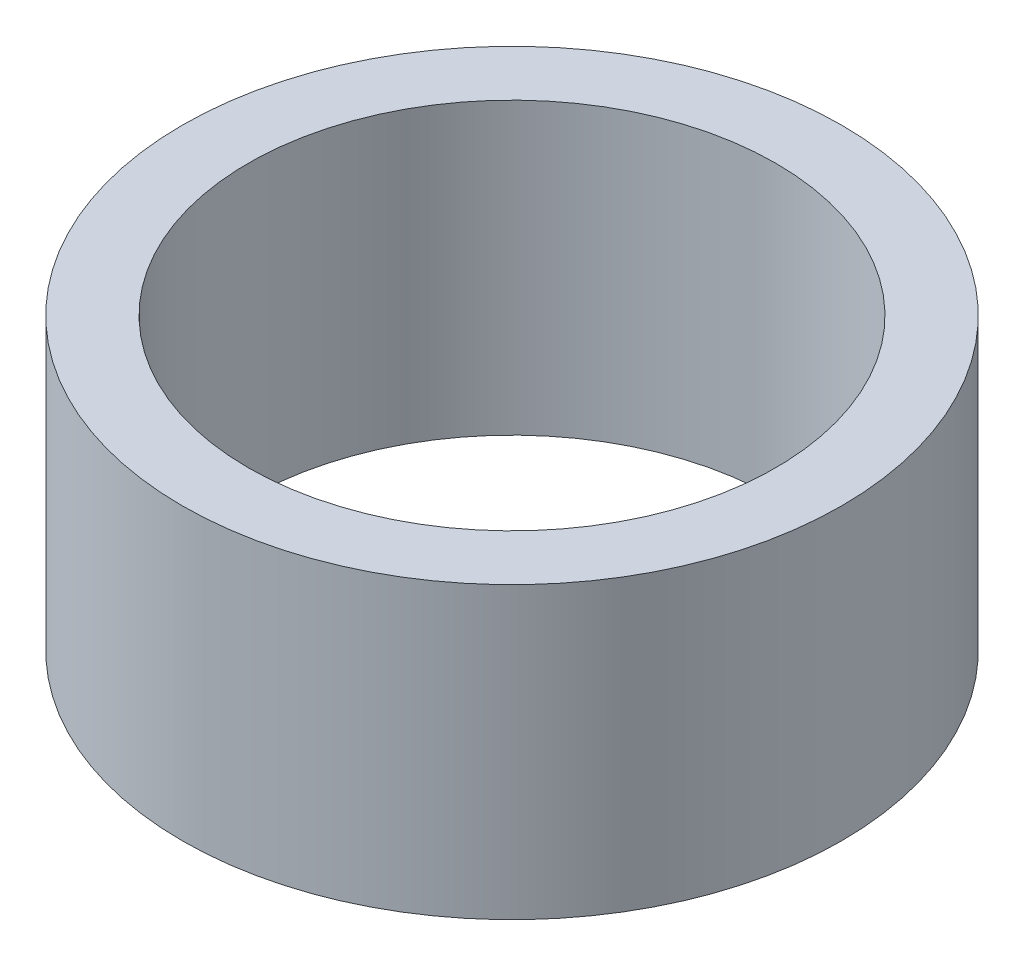
ISO-10303-21;
HEADER;
FILE_DESCRIPTION(('STEP AP214'),'2;1');
FILE_NAME('part.step','',(''),(''),'','','');
FILE_SCHEMA(('AUTOMOTIVE_DESIGN { 1 0 10303 214 1 1 1 1 }'));
ENDSEC;
DATA;
#1=APPLICATION_CONTEXT('core data for automotive mechanical design processes');
#2=APPLICATION_PROTOCOL_DEFINITION('international standard','automotive_design',2000,#1);
#3=PRODUCT_CONTEXT('',#1,'mechanical');
#4=PRODUCT('Part','Part','',(#3));
#5=PRODUCT_RELATED_PRODUCT_CATEGORY('part','',(#4));
#6=PRODUCT_DEFINITION_FORMATION('','',#4);
#7=PRODUCT_DEFINITION_CONTEXT('part definition',#1,'design');
#8=PRODUCT_DEFINITION('design','',#6,#7);
#9=PRODUCT_DEFINITION_SHAPE('','',#8);
#10=(LENGTH_UNIT() NAMED_UNIT(*) SI_UNIT(.MILLI.,.METRE.));
#11=(NAMED_UNIT(*) PLANE_ANGLE_UNIT() SI_UNIT($,.RADIAN.));
#12=(NAMED_UNIT(*) SI_UNIT($,.STERADIAN.) SOLID_ANGLE_UNIT());
#13=UNCERTAINTY_MEASURE_WITH_UNIT(LENGTH_MEASURE(1.E-05),#10,'distance_accuracy_value','');
#14=(GEOMETRIC_REPRESENTATION_CONTEXT(3) GLOBAL_UNCERTAINTY_ASSIGNED_CONTEXT((#13)) GLOBAL_UNIT_ASSIGNED_CONTEXT((#10,
#11,#12)) REPRESENTATION_CONTEXT('',''));
#15=CARTESIAN_POINT('',(0.,0.,0.));
#16=DIRECTION('',(0.,0.,1.));
#17=DIRECTION('',(1.,0.,0.));
#18=AXIS2_PLACEMENT_3D('',#15,#16,#17);
#19=CARTESIAN_POINT('',(0.,-4.4,0.));
#20=DIRECTION('',(0.,1.,0.));
#21=DIRECTION('',(0.,0.,1.));
#22=AXIS2_PLACEMENT_3D('',#19,#20,#21);
#23=CYLINDRICAL_SURFACE('',#22,5.);
#24=CARTESIAN_POINT('',(0.,-4.4,0.));
#25=DIRECTION('',(0.,1.,0.));
#26=DIRECTION('',(0.,0.,1.));
#27=AXIS2_PLACEMENT_3D('',#24,#25,#26);
#28=CIRCLE('',#27,5.);
#29=CARTESIAN_POINT('',(0.,-4.4,5.));
#30=VERTEX_POINT('',#29);
#31=EDGE_CURVE('E10',#30,#30,#28,.T.);
#32=ORIENTED_EDGE('',*,*,#31,.T.);
#33=EDGE_LOOP('',(#32));
#34=FACE_BOUND('',#33,.T.);
#35=CARTESIAN_POINT('',(0.,0.,0.));
#36=DIRECTION('',(0.,1.,0.));
#37=DIRECTION('',(0.,0.,1.));
#38=AXIS2_PLACEMENT_3D('',#35,#36,#37);
#39=CIRCLE('',#38,5.);
#40=CARTESIAN_POINT('',(0.,0.,5.));
#41=VERTEX_POINT('',#40);
#42=EDGE_CURVE('E38',#41,#41,#39,.T.);
#43=ORIENTED_EDGE('',*,*,#42,.F.);
#44=EDGE_LOOP('',(#43));
#45=FACE_BOUND('',#44,.T.);
#46=ADVANCED_FACE('F35',(#34,#45),#23,.T.);
#47=CARTESIAN_POINT('',(0.,-4.4,0.));
#48=DIRECTION('',(0.,1.,0.));
#49=DIRECTION('',(0.,0.,1.));
#50=AXIS2_PLACEMENT_3D('',#47,#48,#49);
#51=PLANE('',#50);
#52=CARTESIAN_POINT('',(0.,-4.4,0.));
#53=DIRECTION('',(0.,1.,0.));
#54=DIRECTION('',(0.,0.,1.));
#55=AXIS2_PLACEMENT_3D('',#52,#53,#54);
#56=CIRCLE('',#55,4.);
#57=CARTESIAN_POINT('',(0.,-4.4,4.));
#58=VERTEX_POINT('',#57);
#59=EDGE_CURVE('E49',#58,#58,#56,.T.);
#60=ORIENTED_EDGE('',*,*,#59,.T.);
#61=EDGE_LOOP('',(#60));
#62=FACE_BOUND('',#61,.T.);
#63=ORIENTED_EDGE('',*,*,#31,.F.);
#64=EDGE_LOOP('',(#63));
#65=FACE_BOUND('',#64,.T.);
#66=ADVANCED_FACE('F57',(#62,#65),#51,.F.);
#67=CARTESIAN_POINT('',(0.,0.,0.));
#68=DIRECTION('',(0.,1.,0.));
#69=DIRECTION('',(0.,0.,1.));
#70=AXIS2_PLACEMENT_3D('',#67,#68,#69);
#71=PLANE('',#70);
#72=CARTESIAN_POINT('',(0.,0.,0.));
#73=DIRECTION('',(0.,1.,0.));
#74=DIRECTION('',(0.,0.,1.));
#75=AXIS2_PLACEMENT_3D('',#72,#73,#74);
#76=CIRCLE('',#75,4.);
#77=CARTESIAN_POINT('',(0.,0.,4.));
#78=VERTEX_POINT('',#77);
#79=EDGE_CURVE('E51',#78,#78,#76,.T.);
#80=ORIENTED_EDGE('',*,*,#79,.F.);
#81=EDGE_LOOP('',(#80));
#82=FACE_BOUND('',#81,.T.);
#83=ORIENTED_EDGE('',*,*,#42,.T.);
#84=EDGE_LOOP('',(#83));
#85=FACE_BOUND('',#84,.T.);
#86=ADVANCED_FACE('F63',(#82,#85),#71,.T.);
#87=CARTESIAN_POINT('',(0.,-4.4,0.));
#88=DIRECTION('',(0.,1.,0.));
#89=DIRECTION('',(0.,0.,1.));
#90=AXIS2_PLACEMENT_3D('',#87,#88,#89);
#91=CYLINDRICAL_SURFACE('',#90,4.);
#92=ORIENTED_EDGE('',*,*,#59,.F.);
#93=EDGE_LOOP('',(#92));
#94=FACE_BOUND('',#93,.T.);
#95=ORIENTED_EDGE('',*,*,#79,.T.);
#96=EDGE_LOOP('',(#95));
#97=FACE_BOUND('',#96,.T.);
#98=ADVANCED_FACE('F60',(#94,#97),#91,.F.);
#99=CLOSED_SHELL('',(#46,#66,#86,#98));
#100=MANIFOLD_SOLID_BREP('B2',#99);
#101=ADVANCED_BREP_SHAPE_REPRESENTATION('',(#18,#100),#14);
#102=SHAPE_DEFINITION_REPRESENTATION(#9,#101);
ENDSEC;
END-ISO-10303-21;
